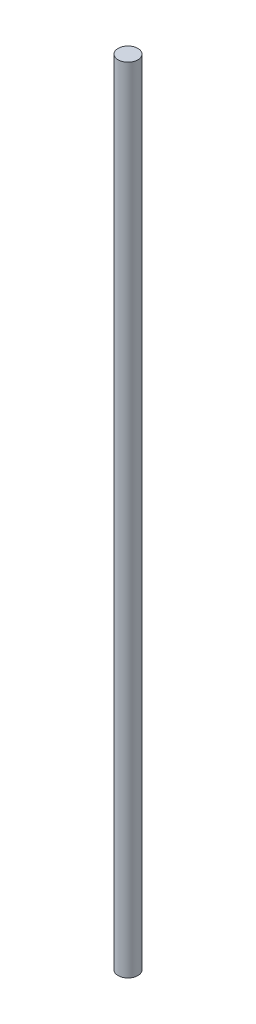
ISO-10303-21;
HEADER;
FILE_DESCRIPTION(('STEP AP214'),'2;1');
FILE_NAME('part.step','',(''),(''),'','','');
FILE_SCHEMA(('AUTOMOTIVE_DESIGN { 1 0 10303 214 1 1 1 1 }'));
ENDSEC;
DATA;
#1=APPLICATION_CONTEXT('core data for automotive mechanical design processes');
#2=APPLICATION_PROTOCOL_DEFINITION('international standard','automotive_design',2000,#1);
#3=PRODUCT_CONTEXT('',#1,'mechanical');
#4=PRODUCT('Part','Part','',(#3));
#5=PRODUCT_RELATED_PRODUCT_CATEGORY('part','',(#4));
#6=PRODUCT_DEFINITION_FORMATION('','',#4);
#7=PRODUCT_DEFINITION_CONTEXT('part definition',#1,'design');
#8=PRODUCT_DEFINITION('design','',#6,#7);
#9=PRODUCT_DEFINITION_SHAPE('','',#8);
#10=(LENGTH_UNIT() NAMED_UNIT(*) SI_UNIT(.MILLI.,.METRE.));
#11=(NAMED_UNIT(*) PLANE_ANGLE_UNIT() SI_UNIT($,.RADIAN.));
#12=(NAMED_UNIT(*) SI_UNIT($,.STERADIAN.) SOLID_ANGLE_UNIT());
#13=UNCERTAINTY_MEASURE_WITH_UNIT(LENGTH_MEASURE(1.E-05),#10,'distance_accuracy_value','');
#14=(GEOMETRIC_REPRESENTATION_CONTEXT(3) GLOBAL_UNCERTAINTY_ASSIGNED_CONTEXT((#13)) GLOBAL_UNIT_ASSIGNED_CONTEXT((#10,
#11,#12)) REPRESENTATION_CONTEXT('',''));
#15=CARTESIAN_POINT('',(0.,0.,0.));
#16=DIRECTION('',(0.,0.,1.));
#17=DIRECTION('',(1.,0.,0.));
#18=AXIS2_PLACEMENT_3D('',#15,#16,#17);
#19=CARTESIAN_POINT('',(0.,800.,0.));
#20=DIRECTION('',(0.,-1.,0.));
#21=DIRECTION('',(0.,0.,-1.));
#22=AXIS2_PLACEMENT_3D('',#19,#20,#21);
#23=CYLINDRICAL_SURFACE('',#22,10.);
#24=CARTESIAN_POINT('',(0.,800.,0.));
#25=DIRECTION('',(0.,1.,0.));
#26=DIRECTION('',(0.,0.,1.));
#27=AXIS2_PLACEMENT_3D('',#24,#25,#26);
#28=CIRCLE('',#27,10.);
#29=CARTESIAN_POINT('',(0.,800.,10.));
#30=VERTEX_POINT('',#29);
#31=EDGE_CURVE('E10',#30,#30,#28,.T.);
#32=ORIENTED_EDGE('',*,*,#31,.F.);
#33=EDGE_LOOP('',(#32));
#34=FACE_BOUND('',#33,.T.);
#35=CARTESIAN_POINT('',(0.,0.,0.));
#36=DIRECTION('',(0.,1.,0.));
#37=DIRECTION('',(0.,0.,1.));
#38=AXIS2_PLACEMENT_3D('',#35,#36,#37);
#39=CIRCLE('',#38,10.);
#40=CARTESIAN_POINT('',(0.,0.,10.));
#41=VERTEX_POINT('',#40);
#42=EDGE_CURVE('E36',#41,#41,#39,.T.);
#43=ORIENTED_EDGE('',*,*,#42,.T.);
#44=EDGE_LOOP('',(#43));
#45=FACE_BOUND('',#44,.T.);
#46=ADVANCED_FACE('F33',(#34,#45),#23,.T.);
#47=CARTESIAN_POINT('',(0.,800.,0.));
#48=DIRECTION('',(0.,1.,0.));
#49=DIRECTION('',(0.,0.,1.));
#50=AXIS2_PLACEMENT_3D('',#47,#48,#49);
#51=PLANE('',#50);
#52=ORIENTED_EDGE('',*,*,#31,.T.);
#53=EDGE_LOOP('',(#52));
#54=FACE_BOUND('',#53,.T.);
#55=ADVANCED_FACE('F48',(#54),#51,.T.);
#56=CARTESIAN_POINT('',(0.,0.,0.));
#57=DIRECTION('',(0.,1.,0.));
#58=DIRECTION('',(0.,0.,1.));
#59=AXIS2_PLACEMENT_3D('',#56,#57,#58);
#60=PLANE('',#59);
#61=ORIENTED_EDGE('',*,*,#42,.F.);
#62=EDGE_LOOP('',(#61));
#63=FACE_BOUND('',#62,.T.);
#64=ADVANCED_FACE('F46',(#63),#60,.F.);
#65=CLOSED_SHELL('',(#46,#55,#64));
#66=MANIFOLD_SOLID_BREP('B2',#65);
#67=ADVANCED_BREP_SHAPE_REPRESENTATION('',(#18,#66),#14);
#68=SHAPE_DEFINITION_REPRESENTATION(#9,#67);
ENDSEC;
END-ISO-10303-21;
